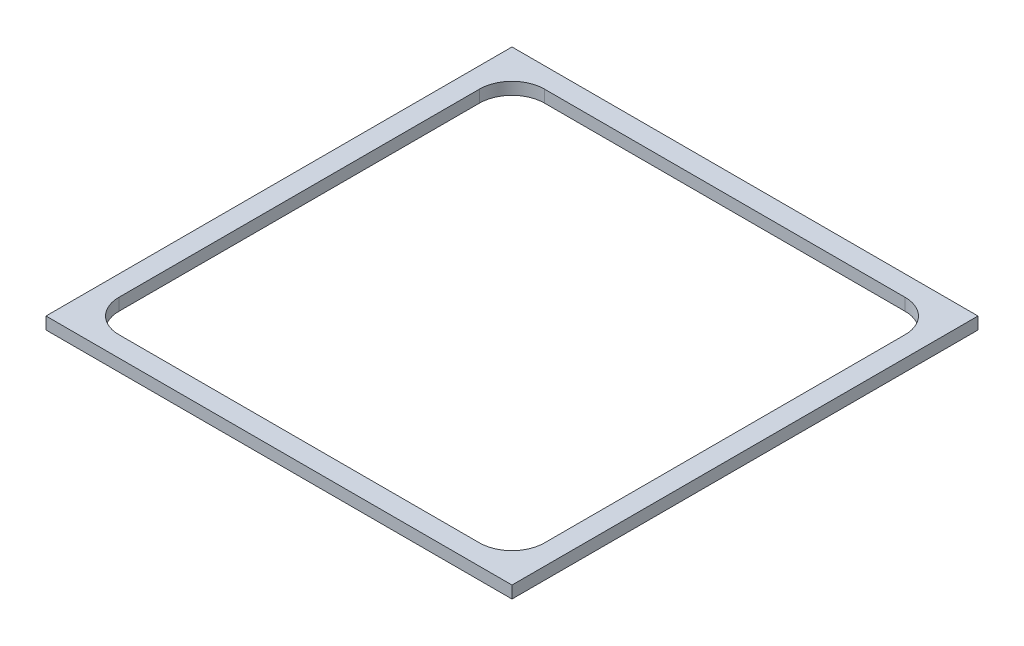
ISO-10303-21;
HEADER;
FILE_DESCRIPTION(('STEP AP214'),'2;1');
FILE_NAME('part.step','',(''),(''),'','','');
FILE_SCHEMA(('AUTOMOTIVE_DESIGN { 1 0 10303 214 1 1 1 1 }'));
ENDSEC;
DATA;
#1=APPLICATION_CONTEXT('core data for automotive mechanical design processes');
#2=APPLICATION_PROTOCOL_DEFINITION('international standard','automotive_design',2000,#1);
#3=PRODUCT_CONTEXT('',#1,'mechanical');
#4=PRODUCT('Part','Part','',(#3));
#5=PRODUCT_RELATED_PRODUCT_CATEGORY('part','',(#4));
#6=PRODUCT_DEFINITION_FORMATION('','',#4);
#7=PRODUCT_DEFINITION_CONTEXT('part definition',#1,'design');
#8=PRODUCT_DEFINITION('design','',#6,#7);
#9=PRODUCT_DEFINITION_SHAPE('','',#8);
#10=(LENGTH_UNIT() NAMED_UNIT(*) SI_UNIT(.MILLI.,.METRE.));
#11=(NAMED_UNIT(*) PLANE_ANGLE_UNIT() SI_UNIT($,.RADIAN.));
#12=(NAMED_UNIT(*) SI_UNIT($,.STERADIAN.) SOLID_ANGLE_UNIT());
#13=UNCERTAINTY_MEASURE_WITH_UNIT(LENGTH_MEASURE(1.E-05),#10,'distance_accuracy_value','');
#14=(GEOMETRIC_REPRESENTATION_CONTEXT(3) GLOBAL_UNCERTAINTY_ASSIGNED_CONTEXT((#13)) GLOBAL_UNIT_ASSIGNED_CONTEXT((#10,
#11,#12)) REPRESENTATION_CONTEXT('',''));
#15=CARTESIAN_POINT('',(0.,0.,0.));
#16=DIRECTION('',(0.,0.,1.));
#17=DIRECTION('',(1.,0.,0.));
#18=AXIS2_PLACEMENT_3D('',#15,#16,#17);
#19=CARTESIAN_POINT('',(0.,3.,0.));
#20=DIRECTION('',(0.,-1.,0.));
#21=DIRECTION('',(0.,0.,-1.));
#22=AXIS2_PLACEMENT_3D('',#19,#20,#21);
#23=PLANE('',#22);
#24=DIRECTION('',(0.,0.,1.));
#25=VECTOR('',#24,1.);
#26=CARTESIAN_POINT('',(-57.5,3.,57.5));
#27=LINE('',#26,#25);
#28=CARTESIAN_POINT('',(-57.5,3.,-57.5));
#29=VERTEX_POINT('',#28);
#30=CARTESIAN_POINT('',(-57.5,3.,57.5));
#31=VERTEX_POINT('',#30);
#32=EDGE_CURVE('E188',#29,#31,#27,.T.);
#33=ORIENTED_EDGE('',*,*,#32,.T.);
#34=DIRECTION('',(1.,0.,0.));
#35=VECTOR('',#34,1.);
#36=CARTESIAN_POINT('',(-57.5,3.,57.5));
#37=LINE('',#36,#35);
#38=CARTESIAN_POINT('',(57.5,3.,57.5));
#39=VERTEX_POINT('',#38);
#40=EDGE_CURVE('E191',#31,#39,#37,.T.);
#41=ORIENTED_EDGE('',*,*,#40,.T.);
#42=DIRECTION('',(0.,0.,-1.));
#43=VECTOR('',#42,1.);
#44=CARTESIAN_POINT('',(57.5,3.,57.5));
#45=LINE('',#44,#43);
#46=CARTESIAN_POINT('',(57.5,3.,-57.5));
#47=VERTEX_POINT('',#46);
#48=EDGE_CURVE('E194',#39,#47,#45,.T.);
#49=ORIENTED_EDGE('',*,*,#48,.T.);
#50=DIRECTION('',(-1.,0.,0.));
#51=VECTOR('',#50,1.);
#52=CARTESIAN_POINT('',(-57.5,3.,-57.5));
#53=LINE('',#52,#51);
#54=EDGE_CURVE('E196',#47,#29,#53,.T.);
#55=ORIENTED_EDGE('',*,*,#54,.T.);
#56=EDGE_LOOP('',(#33,#41,#49,#55));
#57=FACE_BOUND('',#56,.T.);
#58=CARTESIAN_POINT('',(-44.5,3.,-44.5));
#59=DIRECTION('',(0.,1.,0.));
#60=DIRECTION('',(0.,0.,-1.));
#61=AXIS2_PLACEMENT_3D('',#58,#59,#60);
#62=CIRCLE('',#61,8.);
#63=CARTESIAN_POINT('',(-44.5,3.,-52.5));
#64=VERTEX_POINT('',#63);
#65=CARTESIAN_POINT('',(-52.5,3.,-44.5));
#66=VERTEX_POINT('',#65);
#67=EDGE_CURVE('E123',#64,#66,#62,.T.);
#68=ORIENTED_EDGE('',*,*,#67,.F.);
#69=DIRECTION('',(-1.,0.,0.));
#70=VECTOR('',#69,1.);
#71=CARTESIAN_POINT('',(-44.5,3.,-52.5));
#72=LINE('',#71,#70);
#73=CARTESIAN_POINT('',(44.5,3.,-52.5));
#74=VERTEX_POINT('',#73);
#75=EDGE_CURVE('E156',#74,#64,#72,.T.);
#76=ORIENTED_EDGE('',*,*,#75,.F.);
#77=CARTESIAN_POINT('',(44.5,3.,-44.5));
#78=DIRECTION('',(0.,1.,0.));
#79=DIRECTION('',(0.,0.,-1.));
#80=AXIS2_PLACEMENT_3D('',#77,#78,#79);
#81=CIRCLE('',#80,8.);
#82=CARTESIAN_POINT('',(52.5,3.,-44.5));
#83=VERTEX_POINT('',#82);
#84=EDGE_CURVE('E154',#83,#74,#81,.T.);
#85=ORIENTED_EDGE('',*,*,#84,.F.);
#86=DIRECTION('',(0.,0.,-1.));
#87=VECTOR('',#86,1.);
#88=CARTESIAN_POINT('',(52.5,3.,44.5));
#89=LINE('',#88,#87);
#90=CARTESIAN_POINT('',(52.5,3.,44.5));
#91=VERTEX_POINT('',#90);
#92=EDGE_CURVE('E152',#91,#83,#89,.T.);
#93=ORIENTED_EDGE('',*,*,#92,.F.);
#94=CARTESIAN_POINT('',(44.5,3.,44.5));
#95=DIRECTION('',(0.,1.,0.));
#96=DIRECTION('',(0.,0.,-1.));
#97=AXIS2_PLACEMENT_3D('',#94,#95,#96);
#98=CIRCLE('',#97,8.);
#99=CARTESIAN_POINT('',(44.5,3.,52.5));
#100=VERTEX_POINT('',#99);
#101=EDGE_CURVE('E150',#100,#91,#98,.T.);
#102=ORIENTED_EDGE('',*,*,#101,.F.);
#103=DIRECTION('',(1.,0.,0.));
#104=VECTOR('',#103,1.);
#105=CARTESIAN_POINT('',(-44.5,3.,52.5));
#106=LINE('',#105,#104);
#107=CARTESIAN_POINT('',(-44.5,3.,52.5));
#108=VERTEX_POINT('',#107);
#109=EDGE_CURVE('E146',#108,#100,#106,.T.);
#110=ORIENTED_EDGE('',*,*,#109,.F.);
#111=CARTESIAN_POINT('',(-44.5,3.,44.5));
#112=DIRECTION('',(0.,1.,0.));
#113=DIRECTION('',(0.,0.,1.));
#114=AXIS2_PLACEMENT_3D('',#111,#112,#113);
#115=CIRCLE('',#114,8.);
#116=CARTESIAN_POINT('',(-52.5,3.,44.5));
#117=VERTEX_POINT('',#116);
#118=EDGE_CURVE('E144',#117,#108,#115,.T.);
#119=ORIENTED_EDGE('',*,*,#118,.F.);
#120=DIRECTION('',(0.,0.,1.));
#121=VECTOR('',#120,1.);
#122=CARTESIAN_POINT('',(-52.5,3.,44.5));
#123=LINE('',#122,#121);
#124=EDGE_CURVE('E131',#66,#117,#123,.T.);
#125=ORIENTED_EDGE('',*,*,#124,.F.);
#126=EDGE_LOOP('',(#68,#76,#85,#93,#102,#110,#119,#125));
#127=FACE_BOUND('',#126,.T.);
#128=ADVANCED_FACE('F34',(#57,#127),#23,.F.);
#129=CARTESIAN_POINT('',(0.,0.,0.));
#130=DIRECTION('',(0.,-1.,0.));
#131=DIRECTION('',(0.,0.,-1.));
#132=AXIS2_PLACEMENT_3D('',#129,#130,#131);
#133=PLANE('',#132);
#134=DIRECTION('',(0.,0.,1.));
#135=VECTOR('',#134,1.);
#136=CARTESIAN_POINT('',(-57.5,0.,57.5));
#137=LINE('',#136,#135);
#138=CARTESIAN_POINT('',(-57.5,0.,-57.5));
#139=VERTEX_POINT('',#138);
#140=CARTESIAN_POINT('',(-57.5,0.,57.5));
#141=VERTEX_POINT('',#140);
#142=EDGE_CURVE('E139',#139,#141,#137,.T.);
#143=ORIENTED_EDGE('',*,*,#142,.F.);
#144=DIRECTION('',(-1.,0.,0.));
#145=VECTOR('',#144,1.);
#146=CARTESIAN_POINT('',(-57.5,0.,-57.5));
#147=LINE('',#146,#145);
#148=CARTESIAN_POINT('',(57.5,0.,-57.5));
#149=VERTEX_POINT('',#148);
#150=EDGE_CURVE('E192',#149,#139,#147,.T.);
#151=ORIENTED_EDGE('',*,*,#150,.F.);
#152=DIRECTION('',(0.,0.,-1.));
#153=VECTOR('',#152,1.);
#154=CARTESIAN_POINT('',(57.5,0.,57.5));
#155=LINE('',#154,#153);
#156=CARTESIAN_POINT('',(57.5,0.,57.5));
#157=VERTEX_POINT('',#156);
#158=EDGE_CURVE('E203',#157,#149,#155,.T.);
#159=ORIENTED_EDGE('',*,*,#158,.F.);
#160=DIRECTION('',(1.,0.,0.));
#161=VECTOR('',#160,1.);
#162=CARTESIAN_POINT('',(-57.5,0.,57.5));
#163=LINE('',#162,#161);
#164=EDGE_CURVE('E201',#141,#157,#163,.T.);
#165=ORIENTED_EDGE('',*,*,#164,.F.);
#166=EDGE_LOOP('',(#143,#151,#159,#165));
#167=FACE_BOUND('',#166,.T.);
#168=DIRECTION('',(-1.,0.,0.));
#169=VECTOR('',#168,1.);
#170=CARTESIAN_POINT('',(-44.5,0.,-52.5));
#171=LINE('',#170,#169);
#172=CARTESIAN_POINT('',(44.5,0.,-52.5));
#173=VERTEX_POINT('',#172);
#174=CARTESIAN_POINT('',(-44.5,0.,-52.5));
#175=VERTEX_POINT('',#174);
#176=EDGE_CURVE('E132',#173,#175,#171,.T.);
#177=ORIENTED_EDGE('',*,*,#176,.T.);
#178=CARTESIAN_POINT('',(-44.5,0.,-44.5));
#179=DIRECTION('',(0.,1.,0.));
#180=DIRECTION('',(0.,0.,-1.));
#181=AXIS2_PLACEMENT_3D('',#178,#179,#180);
#182=CIRCLE('',#181,8.);
#183=CARTESIAN_POINT('',(-52.5,0.,-44.5));
#184=VERTEX_POINT('',#183);
#185=EDGE_CURVE('E57',#175,#184,#182,.T.);
#186=ORIENTED_EDGE('',*,*,#185,.T.);
#187=DIRECTION('',(0.,0.,1.));
#188=VECTOR('',#187,1.);
#189=CARTESIAN_POINT('',(-52.5,0.,44.5));
#190=LINE('',#189,#188);
#191=CARTESIAN_POINT('',(-52.5,0.,44.5));
#192=VERTEX_POINT('',#191);
#193=EDGE_CURVE('E138',#184,#192,#190,.T.);
#194=ORIENTED_EDGE('',*,*,#193,.T.);
#195=CARTESIAN_POINT('',(-44.5,0.,44.5));
#196=DIRECTION('',(0.,1.,0.));
#197=DIRECTION('',(0.,0.,1.));
#198=AXIS2_PLACEMENT_3D('',#195,#196,#197);
#199=CIRCLE('',#198,8.);
#200=CARTESIAN_POINT('',(-44.5,0.,52.5));
#201=VERTEX_POINT('',#200);
#202=EDGE_CURVE('E160',#192,#201,#199,.T.);
#203=ORIENTED_EDGE('',*,*,#202,.T.);
#204=DIRECTION('',(1.,0.,0.));
#205=VECTOR('',#204,1.);
#206=CARTESIAN_POINT('',(-44.5,0.,52.5));
#207=LINE('',#206,#205);
#208=CARTESIAN_POINT('',(44.5,0.,52.5));
#209=VERTEX_POINT('',#208);
#210=EDGE_CURVE('E163',#201,#209,#207,.T.);
#211=ORIENTED_EDGE('',*,*,#210,.T.);
#212=CARTESIAN_POINT('',(44.5,0.,44.5));
#213=DIRECTION('',(0.,1.,0.));
#214=DIRECTION('',(0.,0.,-1.));
#215=AXIS2_PLACEMENT_3D('',#212,#213,#214);
#216=CIRCLE('',#215,8.);
#217=CARTESIAN_POINT('',(52.5,0.,44.5));
#218=VERTEX_POINT('',#217);
#219=EDGE_CURVE('E166',#209,#218,#216,.T.);
#220=ORIENTED_EDGE('',*,*,#219,.T.);
#221=DIRECTION('',(0.,0.,-1.));
#222=VECTOR('',#221,1.);
#223=CARTESIAN_POINT('',(52.5,0.,44.5));
#224=LINE('',#223,#222);
#225=CARTESIAN_POINT('',(52.5,0.,-44.5));
#226=VERTEX_POINT('',#225);
#227=EDGE_CURVE('E169',#218,#226,#224,.T.);
#228=ORIENTED_EDGE('',*,*,#227,.T.);
#229=CARTESIAN_POINT('',(44.5,0.,-44.5));
#230=DIRECTION('',(0.,1.,0.));
#231=DIRECTION('',(0.,0.,-1.));
#232=AXIS2_PLACEMENT_3D('',#229,#230,#231);
#233=CIRCLE('',#232,8.);
#234=EDGE_CURVE('E172',#226,#173,#233,.T.);
#235=ORIENTED_EDGE('',*,*,#234,.T.);
#236=EDGE_LOOP('',(#177,#186,#194,#203,#211,#220,#228,#235));
#237=FACE_BOUND('',#236,.T.);
#238=ADVANCED_FACE('F221',(#167,#237),#133,.T.);
#239=CARTESIAN_POINT('',(-57.5,3.,57.5));
#240=DIRECTION('',(1.,0.,0.));
#241=DIRECTION('',(0.,0.,-1.));
#242=AXIS2_PLACEMENT_3D('',#239,#240,#241);
#243=PLANE('',#242);
#244=ORIENTED_EDGE('',*,*,#142,.T.);
#245=DIRECTION('',(0.,-1.,0.));
#246=VECTOR('',#245,1.);
#247=CARTESIAN_POINT('',(-57.5,3.,57.5));
#248=LINE('',#247,#246);
#249=EDGE_CURVE('E11',#31,#141,#248,.T.);
#250=ORIENTED_EDGE('',*,*,#249,.F.);
#251=ORIENTED_EDGE('',*,*,#32,.F.);
#252=DIRECTION('',(0.,-1.,0.));
#253=VECTOR('',#252,1.);
#254=CARTESIAN_POINT('',(-57.5,3.,-57.5));
#255=LINE('',#254,#253);
#256=EDGE_CURVE('E198',#29,#139,#255,.T.);
#257=ORIENTED_EDGE('',*,*,#256,.T.);
#258=EDGE_LOOP('',(#244,#250,#251,#257));
#259=FACE_BOUND('',#258,.T.);
#260=ADVANCED_FACE('F36',(#259),#243,.F.);
#261=CARTESIAN_POINT('',(-57.5,3.,57.5));
#262=DIRECTION('',(0.,0.,-1.));
#263=DIRECTION('',(-1.,0.,0.));
#264=AXIS2_PLACEMENT_3D('',#261,#262,#263);
#265=PLANE('',#264);
#266=ORIENTED_EDGE('',*,*,#164,.T.);
#267=DIRECTION('',(0.,-1.,0.));
#268=VECTOR('',#267,1.);
#269=CARTESIAN_POINT('',(57.5,3.,57.5));
#270=LINE('',#269,#268);
#271=EDGE_CURVE('E42',#39,#157,#270,.T.);
#272=ORIENTED_EDGE('',*,*,#271,.F.);
#273=ORIENTED_EDGE('',*,*,#40,.F.);
#274=ORIENTED_EDGE('',*,*,#249,.T.);
#275=EDGE_LOOP('',(#266,#272,#273,#274));
#276=FACE_BOUND('',#275,.T.);
#277=ADVANCED_FACE('F231',(#276),#265,.F.);
#278=CARTESIAN_POINT('',(57.5,3.,57.5));
#279=DIRECTION('',(-1.,0.,0.));
#280=DIRECTION('',(0.,0.,1.));
#281=AXIS2_PLACEMENT_3D('',#278,#279,#280);
#282=PLANE('',#281);
#283=ORIENTED_EDGE('',*,*,#158,.T.);
#284=DIRECTION('',(0.,-1.,0.));
#285=VECTOR('',#284,1.);
#286=CARTESIAN_POINT('',(57.5,3.,-57.5));
#287=LINE('',#286,#285);
#288=EDGE_CURVE('E208',#47,#149,#287,.T.);
#289=ORIENTED_EDGE('',*,*,#288,.F.);
#290=ORIENTED_EDGE('',*,*,#48,.F.);
#291=ORIENTED_EDGE('',*,*,#271,.T.);
#292=EDGE_LOOP('',(#283,#289,#290,#291));
#293=FACE_BOUND('',#292,.T.);
#294=ADVANCED_FACE('F215',(#293),#282,.F.);
#295=CARTESIAN_POINT('',(-57.5,3.,-57.5));
#296=DIRECTION('',(0.,0.,1.));
#297=DIRECTION('',(1.,0.,0.));
#298=AXIS2_PLACEMENT_3D('',#295,#296,#297);
#299=PLANE('',#298);
#300=ORIENTED_EDGE('',*,*,#150,.T.);
#301=ORIENTED_EDGE('',*,*,#256,.F.);
#302=ORIENTED_EDGE('',*,*,#54,.F.);
#303=ORIENTED_EDGE('',*,*,#288,.T.);
#304=EDGE_LOOP('',(#300,#301,#302,#303));
#305=FACE_BOUND('',#304,.T.);
#306=ADVANCED_FACE('F225',(#305),#299,.F.);
#307=CARTESIAN_POINT('',(-44.5,3.,-44.5));
#308=DIRECTION('',(0.,-1.,0.));
#309=DIRECTION('',(0.,0.,-1.));
#310=AXIS2_PLACEMENT_3D('',#307,#308,#309);
#311=CYLINDRICAL_SURFACE('',#310,8.);
#312=ORIENTED_EDGE('',*,*,#185,.F.);
#313=DIRECTION('',(0.,-1.,0.));
#314=VECTOR('',#313,1.);
#315=CARTESIAN_POINT('',(-44.5,3.,-52.5));
#316=LINE('',#315,#314);
#317=EDGE_CURVE('E127',#64,#175,#316,.T.);
#318=ORIENTED_EDGE('',*,*,#317,.F.);
#319=ORIENTED_EDGE('',*,*,#67,.T.);
#320=DIRECTION('',(0.,-1.,0.));
#321=VECTOR('',#320,1.);
#322=CARTESIAN_POINT('',(-52.5,3.,-44.5));
#323=LINE('',#322,#321);
#324=EDGE_CURVE('E126',#66,#184,#323,.T.);
#325=ORIENTED_EDGE('',*,*,#324,.T.);
#326=EDGE_LOOP('',(#312,#318,#319,#325));
#327=FACE_BOUND('',#326,.T.);
#328=ADVANCED_FACE('F125',(#327),#311,.F.);
#329=CARTESIAN_POINT('',(-52.5,3.,44.5));
#330=DIRECTION('',(1.,0.,0.));
#331=DIRECTION('',(0.,0.,-1.));
#332=AXIS2_PLACEMENT_3D('',#329,#330,#331);
#333=PLANE('',#332);
#334=ORIENTED_EDGE('',*,*,#193,.F.);
#335=ORIENTED_EDGE('',*,*,#324,.F.);
#336=ORIENTED_EDGE('',*,*,#124,.T.);
#337=DIRECTION('',(0.,-1.,0.));
#338=VECTOR('',#337,1.);
#339=CARTESIAN_POINT('',(-52.5,3.,44.5));
#340=LINE('',#339,#338);
#341=EDGE_CURVE('E140',#117,#192,#340,.T.);
#342=ORIENTED_EDGE('',*,*,#341,.T.);
#343=EDGE_LOOP('',(#334,#335,#336,#342));
#344=FACE_BOUND('',#343,.T.);
#345=ADVANCED_FACE('F135',(#344),#333,.T.);
#346=CARTESIAN_POINT('',(-44.5,3.,44.5));
#347=DIRECTION('',(0.,-1.,0.));
#348=DIRECTION('',(0.,0.,-1.));
#349=AXIS2_PLACEMENT_3D('',#346,#347,#348);
#350=CYLINDRICAL_SURFACE('',#349,8.);
#351=ORIENTED_EDGE('',*,*,#202,.F.);
#352=ORIENTED_EDGE('',*,*,#341,.F.);
#353=ORIENTED_EDGE('',*,*,#118,.T.);
#354=DIRECTION('',(0.,-1.,0.));
#355=VECTOR('',#354,1.);
#356=CARTESIAN_POINT('',(-44.5,3.,52.5));
#357=LINE('',#356,#355);
#358=EDGE_CURVE('E185',#108,#201,#357,.T.);
#359=ORIENTED_EDGE('',*,*,#358,.T.);
#360=EDGE_LOOP('',(#351,#352,#353,#359));
#361=FACE_BOUND('',#360,.T.);
#362=ADVANCED_FACE('F254',(#361),#350,.F.);
#363=CARTESIAN_POINT('',(-44.5,3.,52.5));
#364=DIRECTION('',(0.,0.,-1.));
#365=DIRECTION('',(-1.,0.,0.));
#366=AXIS2_PLACEMENT_3D('',#363,#364,#365);
#367=PLANE('',#366);
#368=ORIENTED_EDGE('',*,*,#210,.F.);
#369=ORIENTED_EDGE('',*,*,#358,.F.);
#370=ORIENTED_EDGE('',*,*,#109,.T.);
#371=DIRECTION('',(0.,-1.,0.));
#372=VECTOR('',#371,1.);
#373=CARTESIAN_POINT('',(44.5,3.,52.5));
#374=LINE('',#373,#372);
#375=EDGE_CURVE('E183',#100,#209,#374,.T.);
#376=ORIENTED_EDGE('',*,*,#375,.T.);
#377=EDGE_LOOP('',(#368,#369,#370,#376));
#378=FACE_BOUND('',#377,.T.);
#379=ADVANCED_FACE('F258',(#378),#367,.T.);
#380=CARTESIAN_POINT('',(44.5,3.,44.5));
#381=DIRECTION('',(0.,-1.,0.));
#382=DIRECTION('',(0.,0.,-1.));
#383=AXIS2_PLACEMENT_3D('',#380,#381,#382);
#384=CYLINDRICAL_SURFACE('',#383,8.);
#385=ORIENTED_EDGE('',*,*,#219,.F.);
#386=ORIENTED_EDGE('',*,*,#375,.F.);
#387=ORIENTED_EDGE('',*,*,#101,.T.);
#388=DIRECTION('',(0.,-1.,0.));
#389=VECTOR('',#388,1.);
#390=CARTESIAN_POINT('',(52.5,3.,44.5));
#391=LINE('',#390,#389);
#392=EDGE_CURVE('E181',#91,#218,#391,.T.);
#393=ORIENTED_EDGE('',*,*,#392,.T.);
#394=EDGE_LOOP('',(#385,#386,#387,#393));
#395=FACE_BOUND('',#394,.T.);
#396=ADVANCED_FACE('F264',(#395),#384,.F.);
#397=CARTESIAN_POINT('',(52.5,3.,44.5));
#398=DIRECTION('',(-1.,0.,0.));
#399=DIRECTION('',(0.,0.,1.));
#400=AXIS2_PLACEMENT_3D('',#397,#398,#399);
#401=PLANE('',#400);
#402=ORIENTED_EDGE('',*,*,#227,.F.);
#403=ORIENTED_EDGE('',*,*,#392,.F.);
#404=ORIENTED_EDGE('',*,*,#92,.T.);
#405=DIRECTION('',(0.,-1.,0.));
#406=VECTOR('',#405,1.);
#407=CARTESIAN_POINT('',(52.5,3.,-44.5));
#408=LINE('',#407,#406);
#409=EDGE_CURVE('E179',#83,#226,#408,.T.);
#410=ORIENTED_EDGE('',*,*,#409,.T.);
#411=EDGE_LOOP('',(#402,#403,#404,#410));
#412=FACE_BOUND('',#411,.T.);
#413=ADVANCED_FACE('F268',(#412),#401,.T.);
#414=CARTESIAN_POINT('',(44.5,3.,-44.5));
#415=DIRECTION('',(0.,-1.,0.));
#416=DIRECTION('',(0.,0.,-1.));
#417=AXIS2_PLACEMENT_3D('',#414,#415,#416);
#418=CYLINDRICAL_SURFACE('',#417,8.);
#419=ORIENTED_EDGE('',*,*,#234,.F.);
#420=ORIENTED_EDGE('',*,*,#409,.F.);
#421=ORIENTED_EDGE('',*,*,#84,.T.);
#422=DIRECTION('',(0.,-1.,0.));
#423=VECTOR('',#422,1.);
#424=CARTESIAN_POINT('',(44.5,3.,-52.5));
#425=LINE('',#424,#423);
#426=EDGE_CURVE('E49',#74,#173,#425,.T.);
#427=ORIENTED_EDGE('',*,*,#426,.T.);
#428=EDGE_LOOP('',(#419,#420,#421,#427));
#429=FACE_BOUND('',#428,.T.);
#430=ADVANCED_FACE('F272',(#429),#418,.F.);
#431=CARTESIAN_POINT('',(-44.5,3.,-52.5));
#432=DIRECTION('',(0.,0.,1.));
#433=DIRECTION('',(1.,0.,0.));
#434=AXIS2_PLACEMENT_3D('',#431,#432,#433);
#435=PLANE('',#434);
#436=ORIENTED_EDGE('',*,*,#176,.F.);
#437=ORIENTED_EDGE('',*,*,#426,.F.);
#438=ORIENTED_EDGE('',*,*,#75,.T.);
#439=ORIENTED_EDGE('',*,*,#317,.T.);
#440=EDGE_LOOP('',(#436,#437,#438,#439));
#441=FACE_BOUND('',#440,.T.);
#442=ADVANCED_FACE('F276',(#441),#435,.T.);
#443=CLOSED_SHELL('',(#128,#238,#260,#277,#294,#306,#328,#345,#362,#379,#396,#413,#430,#442));
#444=MANIFOLD_SOLID_BREP('B2',#443);
#445=ADVANCED_BREP_SHAPE_REPRESENTATION('',(#18,#444),#14);
#446=SHAPE_DEFINITION_REPRESENTATION(#9,#445);
ENDSEC;
END-ISO-10303-21;
